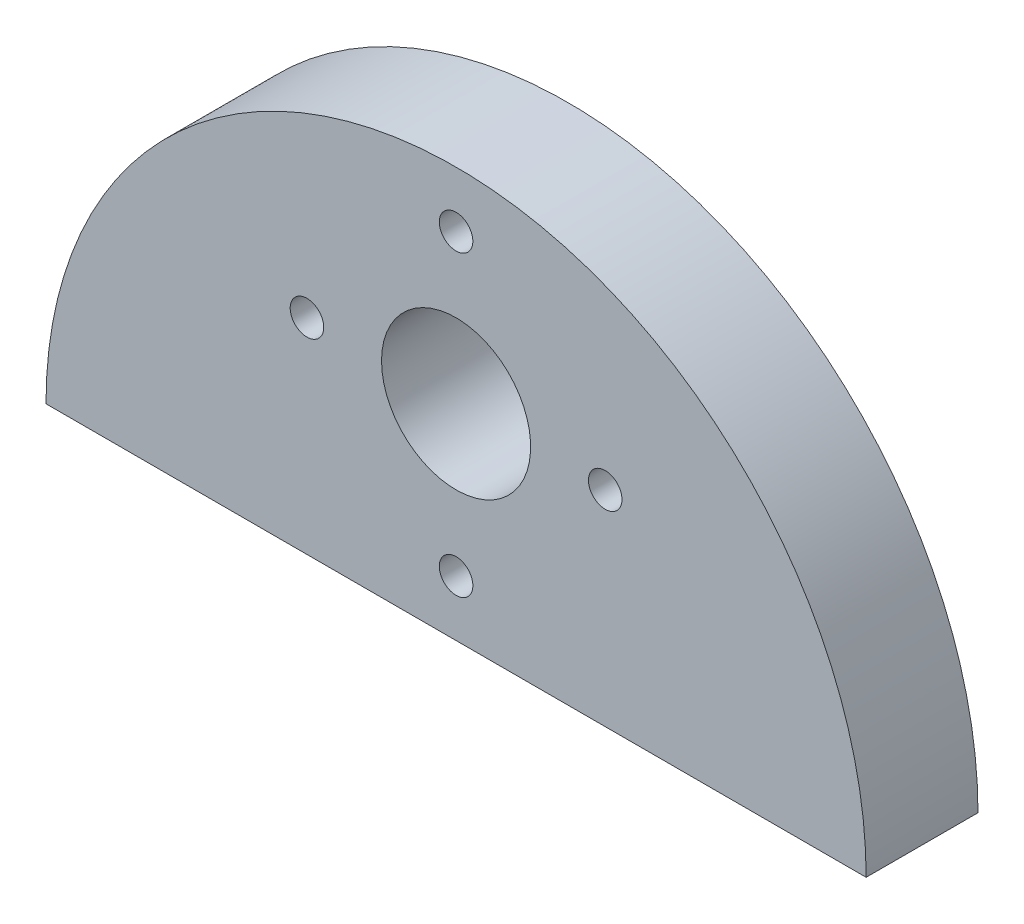
ISO-10303-21;
HEADER;
FILE_DESCRIPTION(('STEP AP214'),'2;1');
FILE_NAME('part.step','',(''),(''),'','','');
FILE_SCHEMA(('AUTOMOTIVE_DESIGN { 1 0 10303 214 1 1 1 1 }'));
ENDSEC;
DATA;
#1=APPLICATION_CONTEXT('core data for automotive mechanical design processes');
#2=APPLICATION_PROTOCOL_DEFINITION('international standard','automotive_design',2000,#1);
#3=PRODUCT_CONTEXT('',#1,'mechanical');
#4=PRODUCT('Part','Part','',(#3));
#5=PRODUCT_RELATED_PRODUCT_CATEGORY('part','',(#4));
#6=PRODUCT_DEFINITION_FORMATION('','',#4);
#7=PRODUCT_DEFINITION_CONTEXT('part definition',#1,'design');
#8=PRODUCT_DEFINITION('design','',#6,#7);
#9=PRODUCT_DEFINITION_SHAPE('','',#8);
#10=(LENGTH_UNIT() NAMED_UNIT(*) SI_UNIT(.MILLI.,.METRE.));
#11=(NAMED_UNIT(*) PLANE_ANGLE_UNIT() SI_UNIT($,.RADIAN.));
#12=(NAMED_UNIT(*) SI_UNIT($,.STERADIAN.) SOLID_ANGLE_UNIT());
#13=UNCERTAINTY_MEASURE_WITH_UNIT(LENGTH_MEASURE(1.E-05),#10,'distance_accuracy_value','');
#14=(GEOMETRIC_REPRESENTATION_CONTEXT(3) GLOBAL_UNCERTAINTY_ASSIGNED_CONTEXT((#13)) GLOBAL_UNIT_ASSIGNED_CONTEXT((#10,
#11,#12)) REPRESENTATION_CONTEXT('',''));
#15=CARTESIAN_POINT('',(0.,0.,0.));
#16=DIRECTION('',(0.,0.,1.));
#17=DIRECTION('',(1.,0.,0.));
#18=AXIS2_PLACEMENT_3D('',#15,#16,#17);
#19=CARTESIAN_POINT('',(0.,0.,6.));
#20=DIRECTION('',(0.,0.,-1.));
#21=DIRECTION('',(-1.,0.,0.));
#22=AXIS2_PLACEMENT_3D('',#19,#20,#21);
#23=CYLINDRICAL_SURFACE('',#22,22.);
#24=CARTESIAN_POINT('',(0.,0.,0.));
#25=DIRECTION('',(0.,0.,-1.));
#26=DIRECTION('',(-1.,0.,0.));
#27=AXIS2_PLACEMENT_3D('',#24,#25,#26);
#28=CIRCLE('',#27,22.);
#29=CARTESIAN_POINT('',(-22.,0.,0.));
#30=VERTEX_POINT('',#29);
#31=CARTESIAN_POINT('',(22.,0.,0.));
#32=VERTEX_POINT('',#31);
#33=EDGE_CURVE('E63',#30,#32,#28,.T.);
#34=ORIENTED_EDGE('',*,*,#33,.F.);
#35=DIRECTION('',(0.,0.,-1.));
#36=VECTOR('',#35,1.);
#37=CARTESIAN_POINT('',(-22.,0.,6.));
#38=LINE('',#37,#36);
#39=CARTESIAN_POINT('',(-22.,0.,6.));
#40=VERTEX_POINT('',#39);
#41=EDGE_CURVE('E11',#40,#30,#38,.T.);
#42=ORIENTED_EDGE('',*,*,#41,.F.);
#43=CARTESIAN_POINT('',(0.,0.,6.));
#44=DIRECTION('',(0.,0.,-1.));
#45=DIRECTION('',(-1.,0.,0.));
#46=AXIS2_PLACEMENT_3D('',#43,#44,#45);
#47=CIRCLE('',#46,22.);
#48=CARTESIAN_POINT('',(22.,0.,6.));
#49=VERTEX_POINT('',#48);
#50=EDGE_CURVE('E64',#40,#49,#47,.T.);
#51=ORIENTED_EDGE('',*,*,#50,.T.);
#52=DIRECTION('',(0.,0.,-1.));
#53=VECTOR('',#52,1.);
#54=CARTESIAN_POINT('',(22.,0.,6.));
#55=LINE('',#54,#53);
#56=EDGE_CURVE('E35',#49,#32,#55,.T.);
#57=ORIENTED_EDGE('',*,*,#56,.T.);
#58=EDGE_LOOP('',(#34,#42,#51,#57));
#59=FACE_BOUND('',#58,.T.);
#60=ADVANCED_FACE('F32',(#59),#23,.T.);
#61=CARTESIAN_POINT('',(-22.,0.,6.));
#62=DIRECTION('',(0.,1.,0.));
#63=DIRECTION('',(0.,0.,1.));
#64=AXIS2_PLACEMENT_3D('',#61,#62,#63);
#65=PLANE('',#64);
#66=DIRECTION('',(1.,0.,0.));
#67=VECTOR('',#66,1.);
#68=CARTESIAN_POINT('',(-22.,0.,0.));
#69=LINE('',#68,#67);
#70=EDGE_CURVE('E57',#30,#32,#69,.T.);
#71=ORIENTED_EDGE('',*,*,#70,.T.);
#72=ORIENTED_EDGE('',*,*,#56,.F.);
#73=DIRECTION('',(1.,0.,0.));
#74=VECTOR('',#73,1.);
#75=CARTESIAN_POINT('',(-22.,0.,6.));
#76=LINE('',#75,#74);
#77=EDGE_CURVE('E59',#40,#49,#76,.T.);
#78=ORIENTED_EDGE('',*,*,#77,.F.);
#79=ORIENTED_EDGE('',*,*,#41,.T.);
#80=EDGE_LOOP('',(#71,#72,#78,#79));
#81=FACE_BOUND('',#80,.T.);
#82=ADVANCED_FACE('F56',(#81),#65,.F.);
#83=CARTESIAN_POINT('',(0.,0.,6.));
#84=DIRECTION('',(0.,0.,-1.));
#85=DIRECTION('',(-1.,0.,0.));
#86=AXIS2_PLACEMENT_3D('',#83,#84,#85);
#87=PLANE('',#86);
#88=CARTESIAN_POINT('',(-8.,11.,6.));
#89=DIRECTION('',(0.,0.,-1.));
#90=DIRECTION('',(1.,0.,0.));
#91=AXIS2_PLACEMENT_3D('',#88,#89,#90);
#92=CIRCLE('',#91,0.899999999999999);
#93=CARTESIAN_POINT('',(-7.1,11.,6.));
#94=VERTEX_POINT('',#93);
#95=EDGE_CURVE('E92',#94,#94,#92,.T.);
#96=ORIENTED_EDGE('',*,*,#95,.T.);
#97=EDGE_LOOP('',(#96));
#98=FACE_BOUND('',#97,.T.);
#99=CARTESIAN_POINT('',(8.,11.,6.));
#100=DIRECTION('',(0.,0.,-1.));
#101=DIRECTION('',(-1.,0.,0.));
#102=AXIS2_PLACEMENT_3D('',#99,#100,#101);
#103=CIRCLE('',#102,0.899999999999999);
#104=CARTESIAN_POINT('',(7.1,11.,6.));
#105=VERTEX_POINT('',#104);
#106=EDGE_CURVE('E86',#105,#105,#103,.T.);
#107=ORIENTED_EDGE('',*,*,#106,.T.);
#108=EDGE_LOOP('',(#107));
#109=FACE_BOUND('',#108,.T.);
#110=CARTESIAN_POINT('',(0.,3.,6.));
#111=DIRECTION('',(0.,0.,-1.));
#112=DIRECTION('',(-1.,0.,0.));
#113=AXIS2_PLACEMENT_3D('',#110,#111,#112);
#114=CIRCLE('',#113,0.9);
#115=CARTESIAN_POINT('',(-0.9,3.,6.));
#116=VERTEX_POINT('',#115);
#117=EDGE_CURVE('E80',#116,#116,#114,.T.);
#118=ORIENTED_EDGE('',*,*,#117,.T.);
#119=EDGE_LOOP('',(#118));
#120=FACE_BOUND('',#119,.T.);
#121=CARTESIAN_POINT('',(0.,19.,6.));
#122=DIRECTION('',(0.,0.,-1.));
#123=DIRECTION('',(-1.,0.,0.));
#124=AXIS2_PLACEMENT_3D('',#121,#122,#123);
#125=CIRCLE('',#124,0.900000000000001);
#126=CARTESIAN_POINT('',(-0.900000000000001,19.,6.));
#127=VERTEX_POINT('',#126);
#128=EDGE_CURVE('E75',#127,#127,#125,.T.);
#129=ORIENTED_EDGE('',*,*,#128,.T.);
#130=EDGE_LOOP('',(#129));
#131=FACE_BOUND('',#130,.T.);
#132=CARTESIAN_POINT('',(0.,11.,6.));
#133=DIRECTION('',(0.,0.,-1.));
#134=DIRECTION('',(-1.,0.,0.));
#135=AXIS2_PLACEMENT_3D('',#132,#133,#134);
#136=CIRCLE('',#135,4.);
#137=CARTESIAN_POINT('',(-4.,11.,6.));
#138=VERTEX_POINT('',#137);
#139=EDGE_CURVE('E66',#138,#138,#136,.T.);
#140=ORIENTED_EDGE('',*,*,#139,.T.);
#141=EDGE_LOOP('',(#140));
#142=FACE_BOUND('',#141,.T.);
#143=ORIENTED_EDGE('',*,*,#50,.F.);
#144=ORIENTED_EDGE('',*,*,#77,.T.);
#145=EDGE_LOOP('',(#143,#144));
#146=FACE_BOUND('',#145,.T.);
#147=ADVANCED_FACE('F101',(#98,#109,#120,#131,#142,#146),#87,.F.);
#148=CARTESIAN_POINT('',(0.,0.,0.));
#149=DIRECTION('',(0.,0.,-1.));
#150=DIRECTION('',(-1.,0.,0.));
#151=AXIS2_PLACEMENT_3D('',#148,#149,#150);
#152=PLANE('',#151);
#153=CARTESIAN_POINT('',(-8.,11.,0.));
#154=DIRECTION('',(0.,0.,-1.));
#155=DIRECTION('',(1.,0.,0.));
#156=AXIS2_PLACEMENT_3D('',#153,#154,#155);
#157=CIRCLE('',#156,0.899999999999999);
#158=CARTESIAN_POINT('',(-7.1,11.,0.));
#159=VERTEX_POINT('',#158);
#160=EDGE_CURVE('E95',#159,#159,#157,.T.);
#161=ORIENTED_EDGE('',*,*,#160,.F.);
#162=EDGE_LOOP('',(#161));
#163=FACE_BOUND('',#162,.T.);
#164=CARTESIAN_POINT('',(8.,11.,0.));
#165=DIRECTION('',(0.,0.,-1.));
#166=DIRECTION('',(-1.,0.,0.));
#167=AXIS2_PLACEMENT_3D('',#164,#165,#166);
#168=CIRCLE('',#167,0.899999999999999);
#169=CARTESIAN_POINT('',(7.1,11.,0.));
#170=VERTEX_POINT('',#169);
#171=EDGE_CURVE('E89',#170,#170,#168,.T.);
#172=ORIENTED_EDGE('',*,*,#171,.F.);
#173=EDGE_LOOP('',(#172));
#174=FACE_BOUND('',#173,.T.);
#175=CARTESIAN_POINT('',(0.,3.,0.));
#176=DIRECTION('',(0.,0.,-1.));
#177=DIRECTION('',(-1.,0.,0.));
#178=AXIS2_PLACEMENT_3D('',#175,#176,#177);
#179=CIRCLE('',#178,0.9);
#180=CARTESIAN_POINT('',(-0.9,3.,0.));
#181=VERTEX_POINT('',#180);
#182=EDGE_CURVE('E83',#181,#181,#179,.T.);
#183=ORIENTED_EDGE('',*,*,#182,.F.);
#184=EDGE_LOOP('',(#183));
#185=FACE_BOUND('',#184,.T.);
#186=CARTESIAN_POINT('',(0.,19.,0.));
#187=DIRECTION('',(0.,0.,-1.));
#188=DIRECTION('',(-1.,0.,0.));
#189=AXIS2_PLACEMENT_3D('',#186,#187,#188);
#190=CIRCLE('',#189,0.900000000000001);
#191=CARTESIAN_POINT('',(-0.900000000000001,19.,0.));
#192=VERTEX_POINT('',#191);
#193=EDGE_CURVE('E77',#192,#192,#190,.T.);
#194=ORIENTED_EDGE('',*,*,#193,.F.);
#195=EDGE_LOOP('',(#194));
#196=FACE_BOUND('',#195,.T.);
#197=CARTESIAN_POINT('',(0.,11.,0.));
#198=DIRECTION('',(0.,0.,-1.));
#199=DIRECTION('',(-1.,0.,0.));
#200=AXIS2_PLACEMENT_3D('',#197,#198,#199);
#201=CIRCLE('',#200,4.);
#202=CARTESIAN_POINT('',(-4.,11.,0.));
#203=VERTEX_POINT('',#202);
#204=EDGE_CURVE('E69',#203,#203,#201,.T.);
#205=ORIENTED_EDGE('',*,*,#204,.F.);
#206=EDGE_LOOP('',(#205));
#207=FACE_BOUND('',#206,.T.);
#208=ORIENTED_EDGE('',*,*,#33,.T.);
#209=ORIENTED_EDGE('',*,*,#70,.F.);
#210=EDGE_LOOP('',(#208,#209));
#211=FACE_BOUND('',#210,.T.);
#212=ADVANCED_FACE('F62',(#163,#174,#185,#196,#207,#211),#152,.T.);
#213=CARTESIAN_POINT('',(0.,11.,6.));
#214=DIRECTION('',(0.,0.,-1.));
#215=DIRECTION('',(-1.,0.,0.));
#216=AXIS2_PLACEMENT_3D('',#213,#214,#215);
#217=CYLINDRICAL_SURFACE('',#216,4.);
#218=ORIENTED_EDGE('',*,*,#139,.F.);
#219=EDGE_LOOP('',(#218));
#220=FACE_BOUND('',#219,.T.);
#221=ORIENTED_EDGE('',*,*,#204,.T.);
#222=EDGE_LOOP('',(#221));
#223=FACE_BOUND('',#222,.T.);
#224=ADVANCED_FACE('F113',(#220,#223),#217,.F.);
#225=CARTESIAN_POINT('',(0.,19.,6.));
#226=DIRECTION('',(0.,0.,-1.));
#227=DIRECTION('',(-1.,0.,0.));
#228=AXIS2_PLACEMENT_3D('',#225,#226,#227);
#229=CYLINDRICAL_SURFACE('',#228,0.900000000000001);
#230=ORIENTED_EDGE('',*,*,#128,.F.);
#231=EDGE_LOOP('',(#230));
#232=FACE_BOUND('',#231,.T.);
#233=ORIENTED_EDGE('',*,*,#193,.T.);
#234=EDGE_LOOP('',(#233));
#235=FACE_BOUND('',#234,.T.);
#236=ADVANCED_FACE('F124',(#232,#235),#229,.F.);
#237=CARTESIAN_POINT('',(0.,3.,6.));
#238=DIRECTION('',(0.,0.,-1.));
#239=DIRECTION('',(-1.,0.,0.));
#240=AXIS2_PLACEMENT_3D('',#237,#238,#239);
#241=CYLINDRICAL_SURFACE('',#240,0.9);
#242=ORIENTED_EDGE('',*,*,#117,.F.);
#243=EDGE_LOOP('',(#242));
#244=FACE_BOUND('',#243,.T.);
#245=ORIENTED_EDGE('',*,*,#182,.T.);
#246=EDGE_LOOP('',(#245));
#247=FACE_BOUND('',#246,.T.);
#248=ADVANCED_FACE('F130',(#244,#247),#241,.F.);
#249=CARTESIAN_POINT('',(8.,11.,6.));
#250=DIRECTION('',(0.,0.,-1.));
#251=DIRECTION('',(-1.,0.,0.));
#252=AXIS2_PLACEMENT_3D('',#249,#250,#251);
#253=CYLINDRICAL_SURFACE('',#252,0.899999999999999);
#254=ORIENTED_EDGE('',*,*,#106,.F.);
#255=EDGE_LOOP('',(#254));
#256=FACE_BOUND('',#255,.T.);
#257=ORIENTED_EDGE('',*,*,#171,.T.);
#258=EDGE_LOOP('',(#257));
#259=FACE_BOUND('',#258,.T.);
#260=ADVANCED_FACE('F107',(#256,#259),#253,.F.);
#261=CARTESIAN_POINT('',(-8.,11.,6.));
#262=DIRECTION('',(0.,0.,-1.));
#263=DIRECTION('',(-1.,0.,0.));
#264=AXIS2_PLACEMENT_3D('',#261,#262,#263);
#265=CYLINDRICAL_SURFACE('',#264,0.899999999999999);
#266=ORIENTED_EDGE('',*,*,#95,.F.);
#267=EDGE_LOOP('',(#266));
#268=FACE_BOUND('',#267,.T.);
#269=ORIENTED_EDGE('',*,*,#160,.T.);
#270=EDGE_LOOP('',(#269));
#271=FACE_BOUND('',#270,.T.);
#272=ADVANCED_FACE('F104',(#268,#271),#265,.F.);
#273=CLOSED_SHELL('',(#60,#82,#147,#212,#224,#236,#248,#260,#272));
#274=MANIFOLD_SOLID_BREP('B2',#273);
#275=ADVANCED_BREP_SHAPE_REPRESENTATION('',(#18,#274),#14);
#276=SHAPE_DEFINITION_REPRESENTATION(#9,#275);
ENDSEC;
END-ISO-10303-21;
